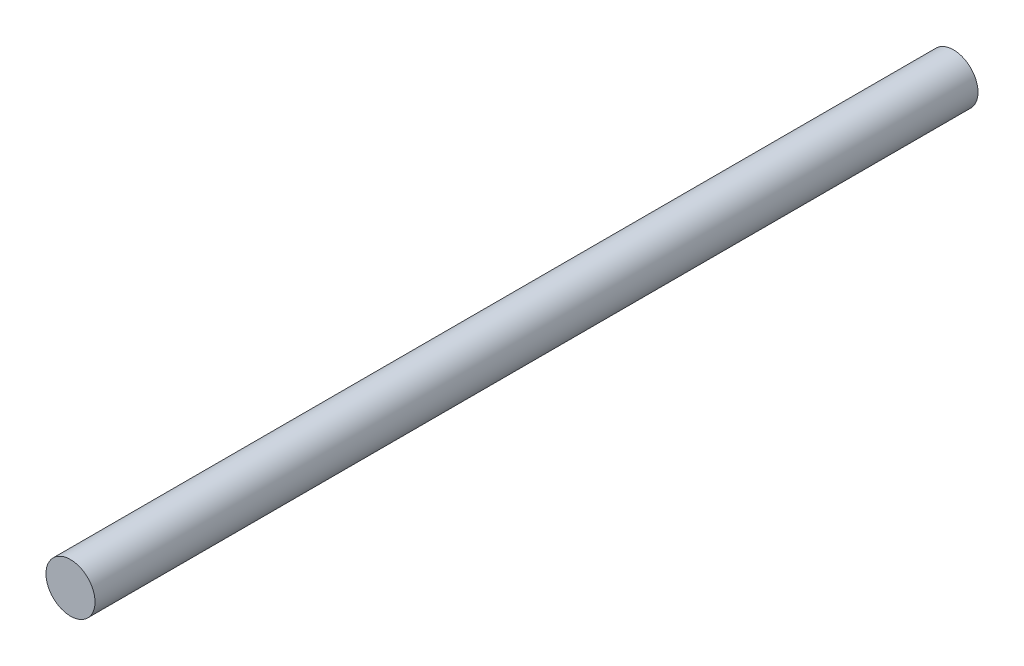
ISO-10303-21;
HEADER;
FILE_DESCRIPTION(('STEP AP214'),'2;1');
FILE_NAME('part.step','',(''),(''),'','','');
FILE_SCHEMA(('AUTOMOTIVE_DESIGN { 1 0 10303 214 1 1 1 1 }'));
ENDSEC;
DATA;
#1=APPLICATION_CONTEXT('core data for automotive mechanical design processes');
#2=APPLICATION_PROTOCOL_DEFINITION('international standard','automotive_design',2000,#1);
#3=PRODUCT_CONTEXT('',#1,'mechanical');
#4=PRODUCT('Part','Part','',(#3));
#5=PRODUCT_RELATED_PRODUCT_CATEGORY('part','',(#4));
#6=PRODUCT_DEFINITION_FORMATION('','',#4);
#7=PRODUCT_DEFINITION_CONTEXT('part definition',#1,'design');
#8=PRODUCT_DEFINITION('design','',#6,#7);
#9=PRODUCT_DEFINITION_SHAPE('','',#8);
#10=(LENGTH_UNIT() NAMED_UNIT(*) SI_UNIT(.MILLI.,.METRE.));
#11=(NAMED_UNIT(*) PLANE_ANGLE_UNIT() SI_UNIT($,.RADIAN.));
#12=(NAMED_UNIT(*) SI_UNIT($,.STERADIAN.) SOLID_ANGLE_UNIT());
#13=UNCERTAINTY_MEASURE_WITH_UNIT(LENGTH_MEASURE(1.E-05),#10,'distance_accuracy_value','');
#14=(GEOMETRIC_REPRESENTATION_CONTEXT(3) GLOBAL_UNCERTAINTY_ASSIGNED_CONTEXT((#13)) GLOBAL_UNIT_ASSIGNED_CONTEXT((#10,
#11,#12)) REPRESENTATION_CONTEXT('',''));
#15=CARTESIAN_POINT('',(0.,0.,0.));
#16=DIRECTION('',(0.,0.,1.));
#17=DIRECTION('',(1.,0.,0.));
#18=AXIS2_PLACEMENT_3D('',#15,#16,#17);
#19=CARTESIAN_POINT('',(0.,0.,114.3));
#20=DIRECTION('',(0.,0.,-1.));
#21=DIRECTION('',(-1.,0.,0.));
#22=AXIS2_PLACEMENT_3D('',#19,#20,#21);
#23=CYLINDRICAL_SURFACE('',#22,3.175);
#24=CARTESIAN_POINT('',(0.,0.,114.3));
#25=DIRECTION('',(0.,0.,1.));
#26=DIRECTION('',(1.,0.,0.));
#27=AXIS2_PLACEMENT_3D('',#24,#25,#26);
#28=CIRCLE('',#27,3.175);
#29=CARTESIAN_POINT('',(3.175,0.,114.3));
#30=VERTEX_POINT('',#29);
#31=EDGE_CURVE('E10',#30,#30,#28,.T.);
#32=ORIENTED_EDGE('',*,*,#31,.F.);
#33=EDGE_LOOP('',(#32));
#34=FACE_BOUND('',#33,.T.);
#35=CARTESIAN_POINT('',(0.,0.,0.));
#36=DIRECTION('',(0.,0.,1.));
#37=DIRECTION('',(1.,0.,0.));
#38=AXIS2_PLACEMENT_3D('',#35,#36,#37);
#39=CIRCLE('',#38,3.175);
#40=CARTESIAN_POINT('',(3.175,0.,0.));
#41=VERTEX_POINT('',#40);
#42=EDGE_CURVE('E40',#41,#41,#39,.T.);
#43=ORIENTED_EDGE('',*,*,#42,.T.);
#44=EDGE_LOOP('',(#43));
#45=FACE_BOUND('',#44,.T.);
#46=ADVANCED_FACE('F37',(#34,#45),#23,.T.);
#47=CARTESIAN_POINT('',(0.,0.,114.3));
#48=DIRECTION('',(0.,0.,1.));
#49=DIRECTION('',(1.,0.,0.));
#50=AXIS2_PLACEMENT_3D('',#47,#48,#49);
#51=PLANE('',#50);
#52=ORIENTED_EDGE('',*,*,#31,.T.);
#53=EDGE_LOOP('',(#52));
#54=FACE_BOUND('',#53,.T.);
#55=ADVANCED_FACE('F54',(#54),#51,.T.);
#56=CARTESIAN_POINT('',(0.,0.,0.));
#57=DIRECTION('',(0.,0.,1.));
#58=DIRECTION('',(1.,0.,0.));
#59=AXIS2_PLACEMENT_3D('',#56,#57,#58);
#60=PLANE('',#59);
#61=ORIENTED_EDGE('',*,*,#42,.F.);
#62=EDGE_LOOP('',(#61));
#63=FACE_BOUND('',#62,.T.);
#64=ADVANCED_FACE('F52',(#63),#60,.F.);
#65=CLOSED_SHELL('',(#46,#55,#64));
#66=MANIFOLD_SOLID_BREP('B2',#65);
#67=ADVANCED_BREP_SHAPE_REPRESENTATION('',(#18,#66),#14);
#68=SHAPE_DEFINITION_REPRESENTATION(#9,#67);
ENDSEC;
END-ISO-10303-21;
